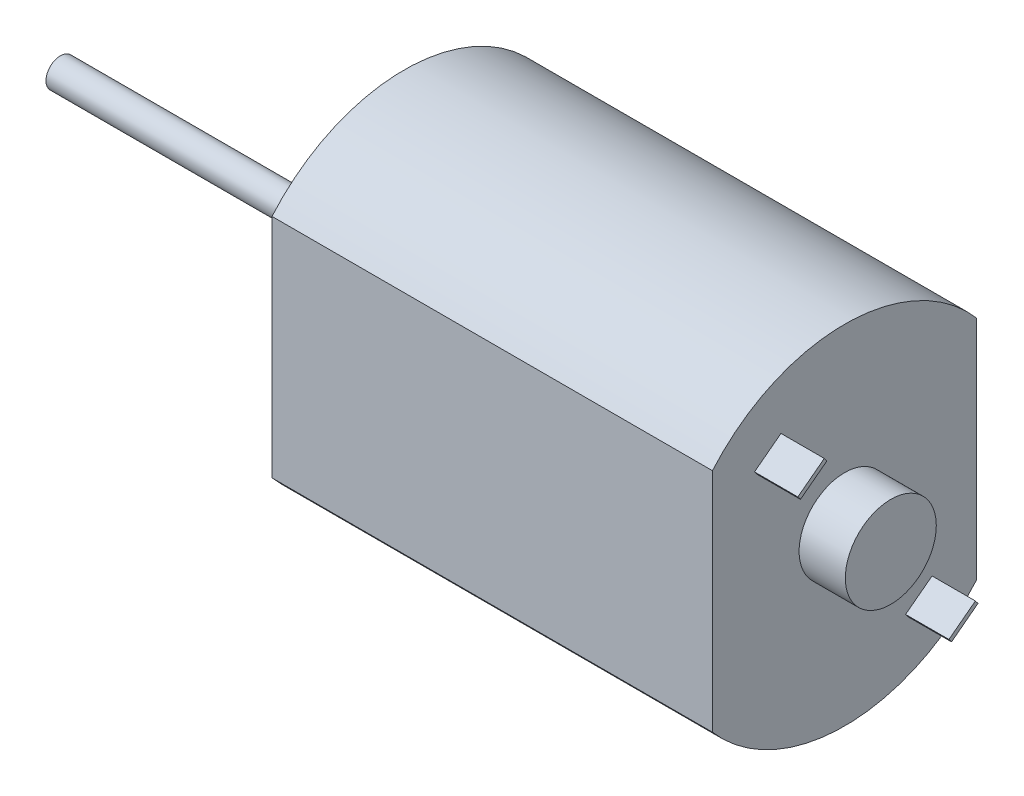
ISO-10303-21;
HEADER;
FILE_DESCRIPTION(('STEP AP214'),'2;1');
FILE_NAME('part.step','',(''),(''),'','','');
FILE_SCHEMA(('AUTOMOTIVE_DESIGN { 1 0 10303 214 1 1 1 1 }'));
ENDSEC;
DATA;
#1=APPLICATION_CONTEXT('core data for automotive mechanical design processes');
#2=APPLICATION_PROTOCOL_DEFINITION('international standard','automotive_design',2000,#1);
#3=PRODUCT_CONTEXT('',#1,'mechanical');
#4=PRODUCT('Part','Part','',(#3));
#5=PRODUCT_RELATED_PRODUCT_CATEGORY('part','',(#4));
#6=PRODUCT_DEFINITION_FORMATION('','',#4);
#7=PRODUCT_DEFINITION_CONTEXT('part definition',#1,'design');
#8=PRODUCT_DEFINITION('design','',#6,#7);
#9=PRODUCT_DEFINITION_SHAPE('','',#8);
#10=(LENGTH_UNIT() NAMED_UNIT(*) SI_UNIT(.MILLI.,.METRE.));
#11=(NAMED_UNIT(*) PLANE_ANGLE_UNIT() SI_UNIT($,.RADIAN.));
#12=(NAMED_UNIT(*) SI_UNIT($,.STERADIAN.) SOLID_ANGLE_UNIT());
#13=UNCERTAINTY_MEASURE_WITH_UNIT(LENGTH_MEASURE(1.E-05),#10,'distance_accuracy_value','');
#14=(GEOMETRIC_REPRESENTATION_CONTEXT(3) GLOBAL_UNCERTAINTY_ASSIGNED_CONTEXT((#13)) GLOBAL_UNIT_ASSIGNED_CONTEXT((#10,
#11,#12)) REPRESENTATION_CONTEXT('',''));
#15=CARTESIAN_POINT('',(0.,0.,0.));
#16=DIRECTION('',(0.,0.,1.));
#17=DIRECTION('',(1.,0.,0.));
#18=AXIS2_PLACEMENT_3D('',#15,#16,#17);
#19=CARTESIAN_POINT('',(30.5,0.,0.));
#20=DIRECTION('',(1.,0.,0.));
#21=DIRECTION('',(0.,0.,-1.));
#22=AXIS2_PLACEMENT_3D('',#19,#20,#21);
#23=PLANE('',#22);
#24=CARTESIAN_POINT('',(30.5,0.,0.));
#25=DIRECTION('',(1.,0.,0.));
#26=DIRECTION('',(0.,0.,-1.));
#27=AXIS2_PLACEMENT_3D('',#24,#25,#26);
#28=CIRCLE('',#27,3.15);
#29=CARTESIAN_POINT('',(30.5,0.,-3.15));
#30=VERTEX_POINT('',#29);
#31=EDGE_CURVE('E11',#30,#30,#28,.T.);
#32=ORIENTED_EDGE('',*,*,#31,.F.);
#33=EDGE_LOOP('',(#32));
#34=FACE_BOUND('',#33,.T.);
#35=DIRECTION('',(0.,1.,0.));
#36=VECTOR('',#35,1.);
#37=CARTESIAN_POINT('',(30.5,0.,-9.15));
#38=LINE('',#37,#36);
#39=CARTESIAN_POINT('',(30.5,-7.84091831356506,-9.15));
#40=VERTEX_POINT('',#39);
#41=CARTESIAN_POINT('',(30.5,7.84091831356506,-9.15));
#42=VERTEX_POINT('',#41);
#43=EDGE_CURVE('E204',#40,#42,#38,.T.);
#44=ORIENTED_EDGE('',*,*,#43,.T.);
#45=CARTESIAN_POINT('',(30.5,0.,0.));
#46=DIRECTION('',(1.,0.,0.));
#47=DIRECTION('',(0.,0.,-1.));
#48=AXIS2_PLACEMENT_3D('',#45,#46,#47);
#49=CIRCLE('',#48,12.05);
#50=CARTESIAN_POINT('',(30.5,7.84091831356506,9.15));
#51=VERTEX_POINT('',#50);
#52=EDGE_CURVE('E207',#42,#51,#49,.T.);
#53=ORIENTED_EDGE('',*,*,#52,.T.);
#54=DIRECTION('',(0.,1.,0.));
#55=VECTOR('',#54,1.);
#56=CARTESIAN_POINT('',(30.5,0.,9.15));
#57=LINE('',#56,#55);
#58=CARTESIAN_POINT('',(30.5,-7.84091831356506,9.15));
#59=VERTEX_POINT('',#58);
#60=EDGE_CURVE('E210',#59,#51,#57,.T.);
#61=ORIENTED_EDGE('',*,*,#60,.F.);
#62=EDGE_CURVE('E211',#59,#40,#49,.T.);
#63=ORIENTED_EDGE('',*,*,#62,.T.);
#64=EDGE_LOOP('',(#44,#53,#61,#63));
#65=FACE_BOUND('',#64,.T.);
#66=DIRECTION('',(0.,0.604748058321728,-0.796416841833534));
#67=VECTOR('',#66,1.);
#68=CARTESIAN_POINT('',(30.5,6.07408288851505,6.05623786384326));
#69=LINE('',#68,#67);
#70=CARTESIAN_POINT('',(30.5,6.07408288851505,6.05623786384326));
#71=VERTEX_POINT('',#70);
#72=CARTESIAN_POINT('',(30.5,7.46500342265502,4.22447912762613));
#73=VERTEX_POINT('',#72);
#74=EDGE_CURVE('E156',#71,#73,#69,.T.);
#75=ORIENTED_EDGE('',*,*,#74,.F.);
#76=DIRECTION('',(0.,-0.796416841833535,-0.604748058321727));
#77=VECTOR('',#76,1.);
#78=CARTESIAN_POINT('',(30.5,6.07408288851505,6.05623786384326));
#79=LINE('',#78,#77);
#80=CARTESIAN_POINT('',(30.5,6.3130079410651,6.23766228133978));
#81=VERTEX_POINT('',#80);
#82=EDGE_CURVE('E153',#81,#71,#79,.T.);
#83=ORIENTED_EDGE('',*,*,#82,.F.);
#84=DIRECTION('',(0.,-0.604748058321729,0.796416841833533));
#85=VECTOR('',#84,1.);
#86=CARTESIAN_POINT('',(30.5,6.3130079410651,6.23766228133978));
#87=LINE('',#86,#85);
#88=CARTESIAN_POINT('',(30.5,7.70392847520508,4.40590354512265));
#89=VERTEX_POINT('',#88);
#90=EDGE_CURVE('E171',#89,#81,#87,.T.);
#91=ORIENTED_EDGE('',*,*,#90,.F.);
#92=DIRECTION('',(0.,0.796416841833536,0.604748058321726));
#93=VECTOR('',#92,1.);
#94=CARTESIAN_POINT('',(30.5,7.46500342265502,4.22447912762613));
#95=LINE('',#94,#93);
#96=EDGE_CURVE('E179',#73,#89,#95,.T.);
#97=ORIENTED_EDGE('',*,*,#96,.F.);
#98=EDGE_LOOP('',(#75,#83,#91,#97));
#99=FACE_BOUND('',#98,.T.);
#100=DIRECTION('',(0.,-0.604748058321728,0.796416841833534));
#101=VECTOR('',#100,1.);
#102=CARTESIAN_POINT('',(30.5,-6.07408288851505,-6.05623786384326));
#103=LINE('',#102,#101);
#104=CARTESIAN_POINT('',(30.5,-6.07408288851505,-6.05623786384326));
#105=VERTEX_POINT('',#104);
#106=CARTESIAN_POINT('',(30.5,-7.46500342265502,-4.22447912762613));
#107=VERTEX_POINT('',#106);
#108=EDGE_CURVE('E152',#105,#107,#103,.T.);
#109=ORIENTED_EDGE('',*,*,#108,.F.);
#110=DIRECTION('',(0.,0.79641684183353,0.604748058321734));
#111=VECTOR('',#110,1.);
#112=CARTESIAN_POINT('',(30.5,-6.3130079410651,-6.23766228133978));
#113=LINE('',#112,#111);
#114=CARTESIAN_POINT('',(30.5,-6.3130079410651,-6.23766228133978));
#115=VERTEX_POINT('',#114);
#116=EDGE_CURVE('E147',#115,#105,#113,.T.);
#117=ORIENTED_EDGE('',*,*,#116,.F.);
#118=DIRECTION('',(0.,0.604748058321728,-0.796416841833533));
#119=VECTOR('',#118,1.);
#120=CARTESIAN_POINT('',(30.5,-6.3130079410651,-6.23766228133978));
#121=LINE('',#120,#119);
#122=CARTESIAN_POINT('',(30.5,-7.70392847520508,-4.40590354512265));
#123=VERTEX_POINT('',#122);
#124=EDGE_CURVE('E132',#123,#115,#121,.T.);
#125=ORIENTED_EDGE('',*,*,#124,.F.);
#126=DIRECTION('',(0.,-0.796416841833533,-0.604748058321729));
#127=VECTOR('',#126,1.);
#128=CARTESIAN_POINT('',(30.5,-7.70392847520508,-4.40590354512265));
#129=LINE('',#128,#127);
#130=EDGE_CURVE('E140',#107,#123,#129,.T.);
#131=ORIENTED_EDGE('',*,*,#130,.F.);
#132=EDGE_LOOP('',(#109,#117,#125,#131));
#133=FACE_BOUND('',#132,.T.);
#134=ADVANCED_FACE('F41',(#34,#65,#99,#133),#23,.T.);
#135=CARTESIAN_POINT('',(30.5,0.,-9.15));
#136=DIRECTION('',(0.,0.,1.));
#137=DIRECTION('',(1.,0.,0.));
#138=AXIS2_PLACEMENT_3D('',#135,#136,#137);
#139=PLANE('',#138);
#140=DIRECTION('',(0.,1.,0.));
#141=VECTOR('',#140,1.);
#142=CARTESIAN_POINT('',(0.,0.,-9.15));
#143=LINE('',#142,#141);
#144=CARTESIAN_POINT('',(0.,-7.84091831356506,-9.15));
#145=VERTEX_POINT('',#144);
#146=CARTESIAN_POINT('',(0.,7.84091831356506,-9.15));
#147=VERTEX_POINT('',#146);
#148=EDGE_CURVE('E199',#145,#147,#143,.T.);
#149=ORIENTED_EDGE('',*,*,#148,.T.);
#150=DIRECTION('',(-1.,0.,0.));
#151=VECTOR('',#150,1.);
#152=CARTESIAN_POINT('',(30.5,7.84091831356506,-9.15));
#153=LINE('',#152,#151);
#154=EDGE_CURVE('E203',#42,#147,#153,.T.);
#155=ORIENTED_EDGE('',*,*,#154,.F.);
#156=ORIENTED_EDGE('',*,*,#43,.F.);
#157=DIRECTION('',(-1.,0.,0.));
#158=VECTOR('',#157,1.);
#159=CARTESIAN_POINT('',(30.5,-7.84091831356506,-9.15));
#160=LINE('',#159,#158);
#161=EDGE_CURVE('E222',#40,#145,#160,.T.);
#162=ORIENTED_EDGE('',*,*,#161,.T.);
#163=EDGE_LOOP('',(#149,#155,#156,#162));
#164=FACE_BOUND('',#163,.T.);
#165=ADVANCED_FACE('F43',(#164),#139,.F.);
#166=CARTESIAN_POINT('',(30.5,0.,0.));
#167=DIRECTION('',(-1.,0.,0.));
#168=DIRECTION('',(0.,0.,1.));
#169=AXIS2_PLACEMENT_3D('',#166,#167,#168);
#170=CYLINDRICAL_SURFACE('',#169,12.05);
#171=CARTESIAN_POINT('',(0.,0.,0.));
#172=DIRECTION('',(1.,0.,0.));
#173=DIRECTION('',(0.,0.,-1.));
#174=AXIS2_PLACEMENT_3D('',#171,#172,#173);
#175=CIRCLE('',#174,12.05);
#176=CARTESIAN_POINT('',(0.,7.84091831356506,9.15));
#177=VERTEX_POINT('',#176);
#178=EDGE_CURVE('E216',#147,#177,#175,.T.);
#179=ORIENTED_EDGE('',*,*,#178,.T.);
#180=DIRECTION('',(-1.,0.,0.));
#181=VECTOR('',#180,1.);
#182=CARTESIAN_POINT('',(30.5,7.84091831356506,9.15));
#183=LINE('',#182,#181);
#184=EDGE_CURVE('E227',#51,#177,#183,.T.);
#185=ORIENTED_EDGE('',*,*,#184,.F.);
#186=ORIENTED_EDGE('',*,*,#52,.F.);
#187=ORIENTED_EDGE('',*,*,#154,.T.);
#188=EDGE_LOOP('',(#179,#185,#186,#187));
#189=FACE_BOUND('',#188,.T.);
#190=ADVANCED_FACE('F231',(#189),#170,.T.);
#191=CARTESIAN_POINT('',(30.5,0.,9.15));
#192=DIRECTION('',(0.,0.,1.));
#193=DIRECTION('',(1.,0.,0.));
#194=AXIS2_PLACEMENT_3D('',#191,#192,#193);
#195=PLANE('',#194);
#196=DIRECTION('',(0.,1.,0.));
#197=VECTOR('',#196,1.);
#198=CARTESIAN_POINT('',(0.,0.,9.15));
#199=LINE('',#198,#197);
#200=CARTESIAN_POINT('',(0.,-7.84091831356506,9.15));
#201=VERTEX_POINT('',#200);
#202=EDGE_CURVE('E219',#201,#177,#199,.T.);
#203=ORIENTED_EDGE('',*,*,#202,.F.);
#204=DIRECTION('',(-1.,0.,0.));
#205=VECTOR('',#204,1.);
#206=CARTESIAN_POINT('',(30.5,-7.84091831356506,9.15));
#207=LINE('',#206,#205);
#208=EDGE_CURVE('E225',#59,#201,#207,.T.);
#209=ORIENTED_EDGE('',*,*,#208,.F.);
#210=ORIENTED_EDGE('',*,*,#60,.T.);
#211=ORIENTED_EDGE('',*,*,#184,.T.);
#212=EDGE_LOOP('',(#203,#209,#210,#211));
#213=FACE_BOUND('',#212,.T.);
#214=ADVANCED_FACE('F242',(#213),#195,.T.);
#215=EDGE_CURVE('E208',#201,#145,#175,.T.);
#216=ORIENTED_EDGE('',*,*,#215,.T.);
#217=ORIENTED_EDGE('',*,*,#161,.F.);
#218=ORIENTED_EDGE('',*,*,#62,.F.);
#219=ORIENTED_EDGE('',*,*,#208,.T.);
#220=EDGE_LOOP('',(#216,#217,#218,#219));
#221=FACE_BOUND('',#220,.T.);
#222=ADVANCED_FACE('F248',(#221),#170,.T.);
#223=CARTESIAN_POINT('',(0.,0.,0.));
#224=DIRECTION('',(1.,0.,0.));
#225=DIRECTION('',(0.,0.,-1.));
#226=AXIS2_PLACEMENT_3D('',#223,#224,#225);
#227=PLANE('',#226);
#228=CARTESIAN_POINT('',(0.,0.,0.));
#229=DIRECTION('',(-1.,0.,0.));
#230=DIRECTION('',(0.,0.,1.));
#231=AXIS2_PLACEMENT_3D('',#228,#229,#230);
#232=CIRCLE('',#231,3.1);
#233=CARTESIAN_POINT('',(0.,0.,3.1));
#234=VERTEX_POINT('',#233);
#235=EDGE_CURVE('E200',#234,#234,#232,.T.);
#236=ORIENTED_EDGE('',*,*,#235,.F.);
#237=EDGE_LOOP('',(#236));
#238=FACE_BOUND('',#237,.T.);
#239=ORIENTED_EDGE('',*,*,#148,.F.);
#240=ORIENTED_EDGE('',*,*,#215,.F.);
#241=ORIENTED_EDGE('',*,*,#202,.T.);
#242=ORIENTED_EDGE('',*,*,#178,.F.);
#243=EDGE_LOOP('',(#239,#240,#241,#242));
#244=FACE_BOUND('',#243,.T.);
#245=ADVANCED_FACE('F239',(#238,#244),#227,.F.);
#246=CARTESIAN_POINT('',(-1.5,0.,0.));
#247=DIRECTION('',(1.,0.,0.));
#248=DIRECTION('',(0.,0.,-1.));
#249=AXIS2_PLACEMENT_3D('',#246,#247,#248);
#250=CYLINDRICAL_SURFACE('',#249,3.1);
#251=CARTESIAN_POINT('',(-1.5,0.,0.));
#252=DIRECTION('',(-1.,0.,0.));
#253=DIRECTION('',(0.,0.,1.));
#254=AXIS2_PLACEMENT_3D('',#251,#252,#253);
#255=CIRCLE('',#254,3.1);
#256=CARTESIAN_POINT('',(-1.5,0.,3.1));
#257=VERTEX_POINT('',#256);
#258=EDGE_CURVE('E196',#257,#257,#255,.T.);
#259=ORIENTED_EDGE('',*,*,#258,.F.);
#260=EDGE_LOOP('',(#259));
#261=FACE_BOUND('',#260,.T.);
#262=ORIENTED_EDGE('',*,*,#235,.T.);
#263=EDGE_LOOP('',(#262));
#264=FACE_BOUND('',#263,.T.);
#265=ADVANCED_FACE('F255',(#261,#264),#250,.T.);
#266=CARTESIAN_POINT('',(-1.5,0.,0.));
#267=DIRECTION('',(-1.,0.,0.));
#268=DIRECTION('',(0.,0.,1.));
#269=AXIS2_PLACEMENT_3D('',#266,#267,#268);
#270=PLANE('',#269);
#271=CARTESIAN_POINT('',(-1.5,0.,0.));
#272=DIRECTION('',(-1.,0.,0.));
#273=DIRECTION('',(0.,0.,1.));
#274=AXIS2_PLACEMENT_3D('',#271,#272,#273);
#275=CIRCLE('',#274,1.);
#276=CARTESIAN_POINT('',(-1.5,0.,1.));
#277=VERTEX_POINT('',#276);
#278=EDGE_CURVE('E45',#277,#277,#275,.T.);
#279=ORIENTED_EDGE('',*,*,#278,.F.);
#280=EDGE_LOOP('',(#279));
#281=FACE_BOUND('',#280,.T.);
#282=ORIENTED_EDGE('',*,*,#258,.T.);
#283=EDGE_LOOP('',(#282));
#284=FACE_BOUND('',#283,.T.);
#285=ADVANCED_FACE('F271',(#281,#284),#270,.T.);
#286=CARTESIAN_POINT('',(-23.8,0.,0.));
#287=DIRECTION('',(1.,0.,0.));
#288=DIRECTION('',(0.,0.,-1.));
#289=AXIS2_PLACEMENT_3D('',#286,#287,#288);
#290=CYLINDRICAL_SURFACE('',#289,1.);
#291=ORIENTED_EDGE('',*,*,#278,.T.);
#292=EDGE_LOOP('',(#291));
#293=FACE_BOUND('',#292,.T.);
#294=CARTESIAN_POINT('',(-23.8,0.,0.));
#295=DIRECTION('',(1.,0.,0.));
#296=DIRECTION('',(0.,0.,-1.));
#297=AXIS2_PLACEMENT_3D('',#294,#295,#296);
#298=CIRCLE('',#297,1.);
#299=CARTESIAN_POINT('',(-23.8,0.,-1.));
#300=VERTEX_POINT('',#299);
#301=EDGE_CURVE('E192',#300,#300,#298,.T.);
#302=ORIENTED_EDGE('',*,*,#301,.T.);
#303=EDGE_LOOP('',(#302));
#304=FACE_BOUND('',#303,.T.);
#305=ADVANCED_FACE('F275',(#293,#304),#290,.T.);
#306=CARTESIAN_POINT('',(-23.8,0.,0.));
#307=DIRECTION('',(1.,0.,0.));
#308=DIRECTION('',(0.,0.,-1.));
#309=AXIS2_PLACEMENT_3D('',#306,#307,#308);
#310=PLANE('',#309);
#311=ORIENTED_EDGE('',*,*,#301,.F.);
#312=EDGE_LOOP('',(#311));
#313=FACE_BOUND('',#312,.T.);
#314=ADVANCED_FACE('F279',(#313),#310,.F.);
#315=CARTESIAN_POINT('',(33.7,0.,0.));
#316=DIRECTION('',(-1.,0.,0.));
#317=DIRECTION('',(0.,0.,1.));
#318=AXIS2_PLACEMENT_3D('',#315,#316,#317);
#319=CYLINDRICAL_SURFACE('',#318,3.15);
#320=CARTESIAN_POINT('',(33.7,0.,0.));
#321=DIRECTION('',(1.,0.,0.));
#322=DIRECTION('',(0.,0.,-1.));
#323=AXIS2_PLACEMENT_3D('',#320,#321,#322);
#324=CIRCLE('',#323,3.15);
#325=CARTESIAN_POINT('',(33.7,0.,-3.15));
#326=VERTEX_POINT('',#325);
#327=EDGE_CURVE('E190',#326,#326,#324,.T.);
#328=ORIENTED_EDGE('',*,*,#327,.F.);
#329=EDGE_LOOP('',(#328));
#330=FACE_BOUND('',#329,.T.);
#331=ORIENTED_EDGE('',*,*,#31,.T.);
#332=EDGE_LOOP('',(#331));
#333=FACE_BOUND('',#332,.T.);
#334=ADVANCED_FACE('F283',(#330,#333),#319,.T.);
#335=CARTESIAN_POINT('',(33.7,0.,0.));
#336=DIRECTION('',(1.,0.,0.));
#337=DIRECTION('',(0.,0.,-1.));
#338=AXIS2_PLACEMENT_3D('',#335,#336,#337);
#339=PLANE('',#338);
#340=ORIENTED_EDGE('',*,*,#327,.T.);
#341=EDGE_LOOP('',(#340));
#342=FACE_BOUND('',#341,.T.);
#343=ADVANCED_FACE('F287',(#342),#339,.T.);
#344=CARTESIAN_POINT('',(33.5,6.07408288851505,6.05623786384326));
#345=DIRECTION('',(0.,0.604748058321727,-0.796416841833534));
#346=DIRECTION('',(0.,0.796416841833535,0.604748058321727));
#347=AXIS2_PLACEMENT_3D('',#344,#345,#346);
#348=PLANE('',#347);
#349=ORIENTED_EDGE('',*,*,#82,.T.);
#350=DIRECTION('',(-1.,0.,0.));
#351=VECTOR('',#350,1.);
#352=CARTESIAN_POINT('',(33.5,6.07408288851505,6.05623786384326));
#353=LINE('',#352,#351);
#354=CARTESIAN_POINT('',(33.5,6.07408288851505,6.05623786384326));
#355=VERTEX_POINT('',#354);
#356=EDGE_CURVE('E188',#355,#71,#353,.T.);
#357=ORIENTED_EDGE('',*,*,#356,.F.);
#358=DIRECTION('',(0.,-0.796416841833535,-0.604748058321727));
#359=VECTOR('',#358,1.);
#360=CARTESIAN_POINT('',(33.5,6.07408288851505,6.05623786384326));
#361=LINE('',#360,#359);
#362=CARTESIAN_POINT('',(33.5,6.3130079410651,6.23766228133978));
#363=VERTEX_POINT('',#362);
#364=EDGE_CURVE('E167',#363,#355,#361,.T.);
#365=ORIENTED_EDGE('',*,*,#364,.F.);
#366=DIRECTION('',(-1.,0.,0.));
#367=VECTOR('',#366,1.);
#368=CARTESIAN_POINT('',(33.5,6.3130079410651,6.23766228133978));
#369=LINE('',#368,#367);
#370=EDGE_CURVE('E176',#363,#81,#369,.T.);
#371=ORIENTED_EDGE('',*,*,#370,.T.);
#372=EDGE_LOOP('',(#349,#357,#365,#371));
#373=FACE_BOUND('',#372,.T.);
#374=ADVANCED_FACE('F291',(#373),#348,.F.);
#375=CARTESIAN_POINT('',(33.5,6.07408288851505,6.05623786384326));
#376=DIRECTION('',(0.,0.796416841833533,0.604748058321728));
#377=DIRECTION('',(0.,-0.604748058321728,0.796416841833533));
#378=AXIS2_PLACEMENT_3D('',#375,#376,#377);
#379=PLANE('',#378);
#380=ORIENTED_EDGE('',*,*,#74,.T.);
#381=DIRECTION('',(-1.,0.,0.));
#382=VECTOR('',#381,1.);
#383=CARTESIAN_POINT('',(33.5,7.46500342265502,4.22447912762613));
#384=LINE('',#383,#382);
#385=CARTESIAN_POINT('',(33.5,7.46500342265502,4.22447912762613));
#386=VERTEX_POINT('',#385);
#387=EDGE_CURVE('E185',#386,#73,#384,.T.);
#388=ORIENTED_EDGE('',*,*,#387,.F.);
#389=DIRECTION('',(0.,0.604748058321728,-0.796416841833534));
#390=VECTOR('',#389,1.);
#391=CARTESIAN_POINT('',(33.5,6.07408288851505,6.05623786384326));
#392=LINE('',#391,#390);
#393=EDGE_CURVE('E170',#355,#386,#392,.T.);
#394=ORIENTED_EDGE('',*,*,#393,.F.);
#395=ORIENTED_EDGE('',*,*,#356,.T.);
#396=EDGE_LOOP('',(#380,#388,#394,#395));
#397=FACE_BOUND('',#396,.T.);
#398=ADVANCED_FACE('F295',(#397),#379,.F.);
#399=CARTESIAN_POINT('',(33.5,7.46500342265502,4.22447912762613));
#400=DIRECTION('',(0.,-0.604748058321726,0.796416841833535));
#401=DIRECTION('',(0.,-0.796416841833536,-0.604748058321726));
#402=AXIS2_PLACEMENT_3D('',#399,#400,#401);
#403=PLANE('',#402);
#404=ORIENTED_EDGE('',*,*,#96,.T.);
#405=DIRECTION('',(-1.,0.,0.));
#406=VECTOR('',#405,1.);
#407=CARTESIAN_POINT('',(33.5,7.70392847520508,4.40590354512265));
#408=LINE('',#407,#406);
#409=CARTESIAN_POINT('',(33.5,7.70392847520508,4.40590354512265));
#410=VERTEX_POINT('',#409);
#411=EDGE_CURVE('E65',#410,#89,#408,.T.);
#412=ORIENTED_EDGE('',*,*,#411,.F.);
#413=DIRECTION('',(0.,0.796416841833536,0.604748058321726));
#414=VECTOR('',#413,1.);
#415=CARTESIAN_POINT('',(33.5,7.46500342265502,4.22447912762613));
#416=LINE('',#415,#414);
#417=EDGE_CURVE('E173',#386,#410,#416,.T.);
#418=ORIENTED_EDGE('',*,*,#417,.F.);
#419=ORIENTED_EDGE('',*,*,#387,.T.);
#420=EDGE_LOOP('',(#404,#412,#418,#419));
#421=FACE_BOUND('',#420,.T.);
#422=ADVANCED_FACE('F299',(#421),#403,.F.);
#423=CARTESIAN_POINT('',(33.5,6.3130079410651,6.23766228133978));
#424=DIRECTION('',(0.,-0.796416841833533,-0.604748058321729));
#425=DIRECTION('',(0.,0.604748058321729,-0.796416841833533));
#426=AXIS2_PLACEMENT_3D('',#423,#424,#425);
#427=PLANE('',#426);
#428=ORIENTED_EDGE('',*,*,#90,.T.);
#429=ORIENTED_EDGE('',*,*,#370,.F.);
#430=DIRECTION('',(0.,-0.604748058321729,0.796416841833533));
#431=VECTOR('',#430,1.);
#432=CARTESIAN_POINT('',(33.5,6.3130079410651,6.23766228133978));
#433=LINE('',#432,#431);
#434=EDGE_CURVE('E175',#410,#363,#433,.T.);
#435=ORIENTED_EDGE('',*,*,#434,.F.);
#436=ORIENTED_EDGE('',*,*,#411,.T.);
#437=EDGE_LOOP('',(#428,#429,#435,#436));
#438=FACE_BOUND('',#437,.T.);
#439=ADVANCED_FACE('F303',(#438),#427,.F.);
#440=CARTESIAN_POINT('',(33.5,0.,0.));
#441=DIRECTION('',(-1.,0.,0.));
#442=DIRECTION('',(0.,0.,1.));
#443=AXIS2_PLACEMENT_3D('',#440,#441,#442);
#444=PLANE('',#443);
#445=ORIENTED_EDGE('',*,*,#364,.T.);
#446=ORIENTED_EDGE('',*,*,#393,.T.);
#447=ORIENTED_EDGE('',*,*,#417,.T.);
#448=ORIENTED_EDGE('',*,*,#434,.T.);
#449=EDGE_LOOP('',(#445,#446,#447,#448));
#450=FACE_BOUND('',#449,.T.);
#451=ADVANCED_FACE('F307',(#450),#444,.F.);
#452=CARTESIAN_POINT('',(33.5,-6.3130079410651,-6.23766228133978));
#453=DIRECTION('',(0.,-0.604748058321733,0.79641684183353));
#454=DIRECTION('',(0.,-0.79641684183353,-0.604748058321734));
#455=AXIS2_PLACEMENT_3D('',#452,#453,#454);
#456=PLANE('',#455);
#457=ORIENTED_EDGE('',*,*,#116,.T.);
#458=DIRECTION('',(-1.,0.,0.));
#459=VECTOR('',#458,1.);
#460=CARTESIAN_POINT('',(33.5,-6.07408288851505,-6.05623786384326));
#461=LINE('',#460,#459);
#462=CARTESIAN_POINT('',(33.5,-6.07408288851505,-6.05623786384326));
#463=VERTEX_POINT('',#462);
#464=EDGE_CURVE('E500',#463,#105,#461,.T.);
#465=ORIENTED_EDGE('',*,*,#464,.F.);
#466=DIRECTION('',(0.,0.79641684183353,0.604748058321734));
#467=VECTOR('',#466,1.);
#468=CARTESIAN_POINT('',(33.5,-6.3130079410651,-6.23766228133978));
#469=LINE('',#468,#467);
#470=CARTESIAN_POINT('',(33.5,-6.3130079410651,-6.23766228133978));
#471=VERTEX_POINT('',#470);
#472=EDGE_CURVE('E141',#471,#463,#469,.T.);
#473=ORIENTED_EDGE('',*,*,#472,.F.);
#474=DIRECTION('',(-1.,0.,0.));
#475=VECTOR('',#474,1.);
#476=CARTESIAN_POINT('',(33.5,-6.3130079410651,-6.23766228133978));
#477=LINE('',#476,#475);
#478=EDGE_CURVE('E135',#471,#115,#477,.T.);
#479=ORIENTED_EDGE('',*,*,#478,.T.);
#480=EDGE_LOOP('',(#457,#465,#473,#479));
#481=FACE_BOUND('',#480,.T.);
#482=ADVANCED_FACE('F145',(#481),#456,.F.);
#483=CARTESIAN_POINT('',(33.5,-6.07408288851505,-6.05623786384326));
#484=DIRECTION('',(0.,-0.796416841833534,-0.604748058321728));
#485=DIRECTION('',(0.,0.604748058321728,-0.796416841833534));
#486=AXIS2_PLACEMENT_3D('',#483,#484,#485);
#487=PLANE('',#486);
#488=ORIENTED_EDGE('',*,*,#108,.T.);
#489=DIRECTION('',(-1.,0.,0.));
#490=VECTOR('',#489,1.);
#491=CARTESIAN_POINT('',(33.5,-7.46500342265502,-4.22447912762613));
#492=LINE('',#491,#490);
#493=CARTESIAN_POINT('',(33.5,-7.46500342265502,-4.22447912762613));
#494=VERTEX_POINT('',#493);
#495=EDGE_CURVE('E498',#494,#107,#492,.T.);
#496=ORIENTED_EDGE('',*,*,#495,.F.);
#497=DIRECTION('',(0.,-0.604748058321728,0.796416841833534));
#498=VECTOR('',#497,1.);
#499=CARTESIAN_POINT('',(33.5,-6.07408288851505,-6.05623786384326));
#500=LINE('',#499,#498);
#501=EDGE_CURVE('E164',#463,#494,#500,.T.);
#502=ORIENTED_EDGE('',*,*,#501,.F.);
#503=ORIENTED_EDGE('',*,*,#464,.T.);
#504=EDGE_LOOP('',(#488,#496,#502,#503));
#505=FACE_BOUND('',#504,.T.);
#506=ADVANCED_FACE('F320',(#505),#487,.F.);
#507=CARTESIAN_POINT('',(33.5,-7.70392847520508,-4.40590354512265));
#508=DIRECTION('',(0.,0.604748058321729,-0.796416841833533));
#509=DIRECTION('',(0.,0.796416841833533,0.604748058321729));
#510=AXIS2_PLACEMENT_3D('',#507,#508,#509);
#511=PLANE('',#510);
#512=ORIENTED_EDGE('',*,*,#130,.T.);
#513=DIRECTION('',(-1.,0.,0.));
#514=VECTOR('',#513,1.);
#515=CARTESIAN_POINT('',(33.5,-7.70392847520508,-4.40590354512265));
#516=LINE('',#515,#514);
#517=CARTESIAN_POINT('',(33.5,-7.70392847520508,-4.40590354512265));
#518=VERTEX_POINT('',#517);
#519=EDGE_CURVE('E57',#518,#123,#516,.T.);
#520=ORIENTED_EDGE('',*,*,#519,.F.);
#521=DIRECTION('',(0.,-0.796416841833533,-0.604748058321729));
#522=VECTOR('',#521,1.);
#523=CARTESIAN_POINT('',(33.5,-7.70392847520508,-4.40590354512265));
#524=LINE('',#523,#522);
#525=EDGE_CURVE('E162',#494,#518,#524,.T.);
#526=ORIENTED_EDGE('',*,*,#525,.F.);
#527=ORIENTED_EDGE('',*,*,#495,.T.);
#528=EDGE_LOOP('',(#512,#520,#526,#527));
#529=FACE_BOUND('',#528,.T.);
#530=ADVANCED_FACE('F317',(#529),#511,.F.);
#531=CARTESIAN_POINT('',(33.5,-6.3130079410651,-6.23766228133978));
#532=DIRECTION('',(0.,0.796416841833533,0.604748058321728));
#533=DIRECTION('',(0.,-0.604748058321728,0.796416841833533));
#534=AXIS2_PLACEMENT_3D('',#531,#532,#533);
#535=PLANE('',#534);
#536=ORIENTED_EDGE('',*,*,#124,.T.);
#537=ORIENTED_EDGE('',*,*,#478,.F.);
#538=DIRECTION('',(0.,0.604748058321728,-0.796416841833533));
#539=VECTOR('',#538,1.);
#540=CARTESIAN_POINT('',(33.5,-6.3130079410651,-6.23766228133978));
#541=LINE('',#540,#539);
#542=EDGE_CURVE('E150',#518,#471,#541,.T.);
#543=ORIENTED_EDGE('',*,*,#542,.F.);
#544=ORIENTED_EDGE('',*,*,#519,.T.);
#545=EDGE_LOOP('',(#536,#537,#543,#544));
#546=FACE_BOUND('',#545,.T.);
#547=ADVANCED_FACE('F134',(#546),#535,.F.);
#548=CARTESIAN_POINT('',(33.5,0.,0.));
#549=DIRECTION('',(1.,0.,0.));
#550=DIRECTION('',(0.,0.,-1.));
#551=AXIS2_PLACEMENT_3D('',#548,#549,#550);
#552=PLANE('',#551);
#553=ORIENTED_EDGE('',*,*,#472,.T.);
#554=ORIENTED_EDGE('',*,*,#501,.T.);
#555=ORIENTED_EDGE('',*,*,#525,.T.);
#556=ORIENTED_EDGE('',*,*,#542,.T.);
#557=EDGE_LOOP('',(#553,#554,#555,#556));
#558=FACE_BOUND('',#557,.T.);
#559=ADVANCED_FACE('F311',(#558),#552,.T.);
#560=CLOSED_SHELL('',(#134,#165,#190,#214,#222,#245,#265,#285,#305,#314,#334,#343,#374,#398,
#422,#439,#451,#482,#506,#530,#547,#559));
#561=MANIFOLD_SOLID_BREP('B2',#560);
#562=ADVANCED_BREP_SHAPE_REPRESENTATION('',(#18,#561),#14);
#563=SHAPE_DEFINITION_REPRESENTATION(#9,#562);
ENDSEC;
END-ISO-10303-21;
